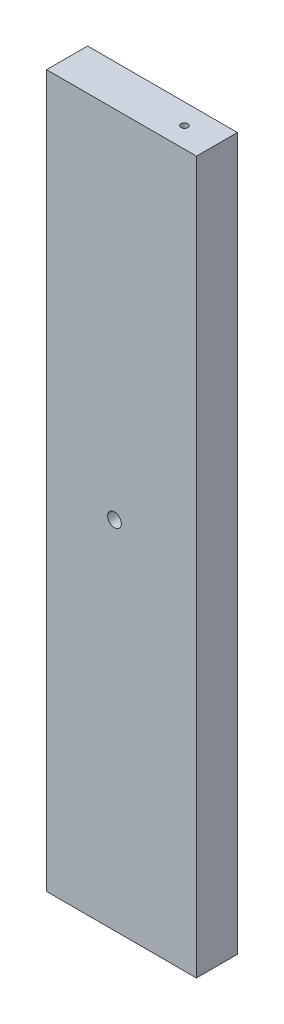
ISO-10303-21;
HEADER;
FILE_DESCRIPTION(('STEP AP214'),'2;1');
FILE_NAME('part.step','',(''),(''),'','','');
FILE_SCHEMA(('AUTOMOTIVE_DESIGN { 1 0 10303 214 1 1 1 1 }'));
ENDSEC;
DATA;
#1=APPLICATION_CONTEXT('core data for automotive mechanical design processes');
#2=APPLICATION_PROTOCOL_DEFINITION('international standard','automotive_design',2000,#1);
#3=PRODUCT_CONTEXT('',#1,'mechanical');
#4=PRODUCT('Part','Part','',(#3));
#5=PRODUCT_RELATED_PRODUCT_CATEGORY('part','',(#4));
#6=PRODUCT_DEFINITION_FORMATION('','',#4);
#7=PRODUCT_DEFINITION_CONTEXT('part definition',#1,'design');
#8=PRODUCT_DEFINITION('design','',#6,#7);
#9=PRODUCT_DEFINITION_SHAPE('','',#8);
#10=(LENGTH_UNIT() NAMED_UNIT(*) SI_UNIT(.MILLI.,.METRE.));
#11=(NAMED_UNIT(*) PLANE_ANGLE_UNIT() SI_UNIT($,.RADIAN.));
#12=(NAMED_UNIT(*) SI_UNIT($,.STERADIAN.) SOLID_ANGLE_UNIT());
#13=UNCERTAINTY_MEASURE_WITH_UNIT(LENGTH_MEASURE(1.E-05),#10,'distance_accuracy_value','');
#14=(GEOMETRIC_REPRESENTATION_CONTEXT(3) GLOBAL_UNCERTAINTY_ASSIGNED_CONTEXT((#13)) GLOBAL_UNIT_ASSIGNED_CONTEXT((#10,
#11,#12)) REPRESENTATION_CONTEXT('',''));
#15=CARTESIAN_POINT('',(0.,0.,0.));
#16=DIRECTION('',(0.,0.,1.));
#17=DIRECTION('',(1.,0.,0.));
#18=AXIS2_PLACEMENT_3D('',#15,#16,#17);
#19=CARTESIAN_POINT('',(209.352967180645,93.4499999969934,19.05));
#20=DIRECTION('',(1.,0.,0.));
#21=DIRECTION('',(0.,1.,0.));
#22=AXIS2_PLACEMENT_3D('',#19,#20,#21);
#23=PLANE('',#22);
#24=DIRECTION('',(0.,-1.,0.));
#25=VECTOR('',#24,1.);
#26=CARTESIAN_POINT('',(209.352967180645,93.4499999969934,0.));
#27=LINE('',#26,#25);
#28=CARTESIAN_POINT('',(209.352967180645,93.4499999969934,0.));
#29=VERTEX_POINT('',#28);
#30=CARTESIAN_POINT('',(209.352967180645,-237.499999991006,0.));
#31=VERTEX_POINT('',#30);
#32=EDGE_CURVE('E103',#29,#31,#27,.T.);
#33=ORIENTED_EDGE('',*,*,#32,.T.);
#34=DIRECTION('',(0.,0.,-1.));
#35=VECTOR('',#34,1.);
#36=CARTESIAN_POINT('',(209.352967180645,-237.499999991006,19.05));
#37=LINE('',#36,#35);
#38=CARTESIAN_POINT('',(209.352967180645,-237.499999991006,19.05));
#39=VERTEX_POINT('',#38);
#40=EDGE_CURVE('E11',#39,#31,#37,.T.);
#41=ORIENTED_EDGE('',*,*,#40,.F.);
#42=DIRECTION('',(0.,-1.,0.));
#43=VECTOR('',#42,1.);
#44=CARTESIAN_POINT('',(209.352967180645,93.4499999969934,19.05));
#45=LINE('',#44,#43);
#46=CARTESIAN_POINT('',(209.352967180645,93.4499999969934,19.05));
#47=VERTEX_POINT('',#46);
#48=EDGE_CURVE('E104',#47,#39,#45,.T.);
#49=ORIENTED_EDGE('',*,*,#48,.F.);
#50=DIRECTION('',(0.,0.,-1.));
#51=VECTOR('',#50,1.);
#52=CARTESIAN_POINT('',(209.352967180645,93.4499999969934,19.05));
#53=LINE('',#52,#51);
#54=EDGE_CURVE('E110',#47,#29,#53,.T.);
#55=ORIENTED_EDGE('',*,*,#54,.T.);
#56=EDGE_LOOP('',(#33,#41,#49,#55));
#57=FACE_BOUND('',#56,.T.);
#58=ADVANCED_FACE('F33',(#57),#23,.F.);
#59=CARTESIAN_POINT('',(209.352967180645,-237.499999991006,19.05));
#60=DIRECTION('',(0.,1.,0.));
#61=DIRECTION('',(0.,0.,1.));
#62=AXIS2_PLACEMENT_3D('',#59,#60,#61);
#63=PLANE('',#62);
#64=DIRECTION('',(1.,0.,0.));
#65=VECTOR('',#64,1.);
#66=CARTESIAN_POINT('',(209.352967180645,-237.499999991006,0.));
#67=LINE('',#66,#65);
#68=CARTESIAN_POINT('',(279.019945862424,-237.499999991006,0.));
#69=VERTEX_POINT('',#68);
#70=EDGE_CURVE('E113',#31,#69,#67,.T.);
#71=ORIENTED_EDGE('',*,*,#70,.T.);
#72=DIRECTION('',(0.,0.,-1.));
#73=VECTOR('',#72,1.);
#74=CARTESIAN_POINT('',(279.019945862424,-237.499999991006,19.05));
#75=LINE('',#74,#73);
#76=CARTESIAN_POINT('',(279.019945862424,-237.499999991006,19.05));
#77=VERTEX_POINT('',#76);
#78=EDGE_CURVE('E42',#77,#69,#75,.T.);
#79=ORIENTED_EDGE('',*,*,#78,.F.);
#80=DIRECTION('',(1.,0.,0.));
#81=VECTOR('',#80,1.);
#82=CARTESIAN_POINT('',(209.352967180645,-237.499999991006,19.05));
#83=LINE('',#82,#81);
#84=EDGE_CURVE('E81',#39,#77,#83,.T.);
#85=ORIENTED_EDGE('',*,*,#84,.F.);
#86=ORIENTED_EDGE('',*,*,#40,.T.);
#87=EDGE_LOOP('',(#71,#79,#85,#86));
#88=FACE_BOUND('',#87,.T.);
#89=ADVANCED_FACE('F139',(#88),#63,.F.);
#90=CARTESIAN_POINT('',(279.019945862424,93.4499999969934,19.05));
#91=DIRECTION('',(-1.,0.,0.));
#92=DIRECTION('',(0.,-1.,0.));
#93=AXIS2_PLACEMENT_3D('',#90,#91,#92);
#94=PLANE('',#93);
#95=DIRECTION('',(0.,1.,0.));
#96=VECTOR('',#95,1.);
#97=CARTESIAN_POINT('',(279.019945862424,93.4499999969934,0.));
#98=LINE('',#97,#96);
#99=CARTESIAN_POINT('',(279.019945862424,93.4499999969934,0.));
#100=VERTEX_POINT('',#99);
#101=EDGE_CURVE('E68',#69,#100,#98,.T.);
#102=ORIENTED_EDGE('',*,*,#101,.T.);
#103=DIRECTION('',(0.,0.,-1.));
#104=VECTOR('',#103,1.);
#105=CARTESIAN_POINT('',(279.019945862424,93.4499999969934,19.05));
#106=LINE('',#105,#104);
#107=CARTESIAN_POINT('',(279.019945862424,93.4499999969934,19.05));
#108=VERTEX_POINT('',#107);
#109=EDGE_CURVE('E118',#108,#100,#106,.T.);
#110=ORIENTED_EDGE('',*,*,#109,.F.);
#111=DIRECTION('',(0.,1.,0.));
#112=VECTOR('',#111,1.);
#113=CARTESIAN_POINT('',(279.019945862424,93.4499999969934,19.05));
#114=LINE('',#113,#112);
#115=EDGE_CURVE('E107',#77,#108,#114,.T.);
#116=ORIENTED_EDGE('',*,*,#115,.F.);
#117=ORIENTED_EDGE('',*,*,#78,.T.);
#118=EDGE_LOOP('',(#102,#110,#116,#117));
#119=FACE_BOUND('',#118,.T.);
#120=ADVANCED_FACE('F121',(#119),#94,.F.);
#121=CARTESIAN_POINT('',(209.352967180645,93.4499999969934,19.05));
#122=DIRECTION('',(0.,-1.,0.));
#123=DIRECTION('',(0.,0.,-1.));
#124=AXIS2_PLACEMENT_3D('',#121,#122,#123);
#125=PLANE('',#124);
#126=CARTESIAN_POINT('',(263.929639335459,93.4499999969934,9.52499999999611));
#127=DIRECTION('',(0.,-1.,0.));
#128=DIRECTION('',(0.,0.,-1.));
#129=AXIS2_PLACEMENT_3D('',#126,#127,#128);
#130=CIRCLE('',#129,1.58750000000002);
#131=CARTESIAN_POINT('',(263.929639335459,93.4499999969934,7.93749999999609));
#132=VERTEX_POINT('',#131);
#133=EDGE_CURVE('E36',#132,#132,#130,.T.);
#134=ORIENTED_EDGE('',*,*,#133,.T.);
#135=EDGE_LOOP('',(#134));
#136=FACE_BOUND('',#135,.T.);
#137=DIRECTION('',(-1.,0.,0.));
#138=VECTOR('',#137,1.);
#139=CARTESIAN_POINT('',(209.352967180645,93.4499999969934,0.));
#140=LINE('',#139,#138);
#141=EDGE_CURVE('E74',#100,#29,#140,.T.);
#142=ORIENTED_EDGE('',*,*,#141,.T.);
#143=ORIENTED_EDGE('',*,*,#54,.F.);
#144=DIRECTION('',(-1.,0.,0.));
#145=VECTOR('',#144,1.);
#146=CARTESIAN_POINT('',(209.352967180645,93.4499999969934,19.05));
#147=LINE('',#146,#145);
#148=EDGE_CURVE('E50',#108,#47,#147,.T.);
#149=ORIENTED_EDGE('',*,*,#148,.F.);
#150=ORIENTED_EDGE('',*,*,#109,.T.);
#151=EDGE_LOOP('',(#142,#143,#149,#150));
#152=FACE_BOUND('',#151,.T.);
#153=ADVANCED_FACE('F128',(#136,#152),#125,.F.);
#154=CARTESIAN_POINT('',(0.,0.,19.05));
#155=DIRECTION('',(0.,0.,1.));
#156=DIRECTION('',(1.,0.,0.));
#157=AXIS2_PLACEMENT_3D('',#154,#155,#156);
#158=PLANE('',#157);
#159=CARTESIAN_POINT('',(240.91994586243,-72.0249999971041,19.05));
#160=DIRECTION('',(0.,0.,-1.));
#161=DIRECTION('',(-1.,0.,0.));
#162=AXIS2_PLACEMENT_3D('',#159,#160,#161);
#163=CIRCLE('',#162,3.17499999999993);
#164=CARTESIAN_POINT('',(237.744945862431,-72.0249999971041,19.05));
#165=VERTEX_POINT('',#164);
#166=EDGE_CURVE('E100',#165,#165,#163,.T.);
#167=ORIENTED_EDGE('',*,*,#166,.T.);
#168=EDGE_LOOP('',(#167));
#169=FACE_BOUND('',#168,.T.);
#170=ORIENTED_EDGE('',*,*,#48,.T.);
#171=ORIENTED_EDGE('',*,*,#84,.T.);
#172=ORIENTED_EDGE('',*,*,#115,.T.);
#173=ORIENTED_EDGE('',*,*,#148,.T.);
#174=EDGE_LOOP('',(#170,#171,#172,#173));
#175=FACE_BOUND('',#174,.T.);
#176=ADVANCED_FACE('F130',(#169,#175),#158,.T.);
#177=CARTESIAN_POINT('',(0.,0.,0.));
#178=DIRECTION('',(0.,0.,1.));
#179=DIRECTION('',(1.,0.,0.));
#180=AXIS2_PLACEMENT_3D('',#177,#178,#179);
#181=PLANE('',#180);
#182=CARTESIAN_POINT('',(240.91994586243,-72.0249999971041,0.));
#183=DIRECTION('',(0.,0.,-1.));
#184=DIRECTION('',(-1.,0.,0.));
#185=AXIS2_PLACEMENT_3D('',#182,#183,#184);
#186=CIRCLE('',#185,3.17499999999993);
#187=CARTESIAN_POINT('',(237.744945862431,-72.0249999971041,0.));
#188=VERTEX_POINT('',#187);
#189=EDGE_CURVE('E96',#188,#188,#186,.T.);
#190=ORIENTED_EDGE('',*,*,#189,.F.);
#191=EDGE_LOOP('',(#190));
#192=FACE_BOUND('',#191,.T.);
#193=ORIENTED_EDGE('',*,*,#32,.F.);
#194=ORIENTED_EDGE('',*,*,#141,.F.);
#195=ORIENTED_EDGE('',*,*,#101,.F.);
#196=ORIENTED_EDGE('',*,*,#70,.F.);
#197=EDGE_LOOP('',(#193,#194,#195,#196));
#198=FACE_BOUND('',#197,.T.);
#199=ADVANCED_FACE('F124',(#192,#198),#181,.F.);
#200=CARTESIAN_POINT('',(240.91994586243,-72.0249999971041,0.));
#201=DIRECTION('',(0.,0.,-1.));
#202=DIRECTION('',(-1.,0.,0.));
#203=AXIS2_PLACEMENT_3D('',#200,#201,#202);
#204=CYLINDRICAL_SURFACE('',#203,3.17499999999993);
#205=ORIENTED_EDGE('',*,*,#166,.F.);
#206=EDGE_LOOP('',(#205));
#207=FACE_BOUND('',#206,.T.);
#208=ORIENTED_EDGE('',*,*,#189,.T.);
#209=EDGE_LOOP('',(#208));
#210=FACE_BOUND('',#209,.T.);
#211=ADVANCED_FACE('F168',(#207,#210),#204,.F.);
#212=CARTESIAN_POINT('',(263.929639335459,112.499999997011,9.52499999999612));
#213=DIRECTION('',(0.,1.,0.));
#214=DIRECTION('',(0.,0.,1.));
#215=AXIS2_PLACEMENT_3D('',#212,#213,#214);
#216=CYLINDRICAL_SURFACE('',#215,1.58750000000002);
#217=CARTESIAN_POINT('',(263.929639335459,74.3999999970112,9.52499999999609));
#218=DIRECTION('',(0.,1.,0.));
#219=DIRECTION('',(0.,0.,1.));
#220=AXIS2_PLACEMENT_3D('',#217,#218,#219);
#221=CIRCLE('',#220,1.58750000000002);
#222=CARTESIAN_POINT('',(263.929639335459,74.3999999970112,11.1124999999961));
#223=VERTEX_POINT('',#222);
#224=EDGE_CURVE('E92',#223,#223,#221,.T.);
#225=ORIENTED_EDGE('',*,*,#224,.F.);
#226=EDGE_LOOP('',(#225));
#227=FACE_BOUND('',#226,.T.);
#228=ORIENTED_EDGE('',*,*,#133,.F.);
#229=EDGE_LOOP('',(#228));
#230=FACE_BOUND('',#229,.T.);
#231=ADVANCED_FACE('F88',(#227,#230),#216,.F.);
#232=CARTESIAN_POINT('',(263.929639335459,74.3999999970112,9.52499999999609));
#233=DIRECTION('',(0.,1.,0.));
#234=DIRECTION('',(0.,0.,1.));
#235=AXIS2_PLACEMENT_3D('',#232,#233,#234);
#236=CONICAL_SURFACE('',#235,1.58750000000002,1.02974425867666);
#237=CARTESIAN_POINT('',(263.929639335459,73.446133764305,9.52499999999609));
#238=VERTEX_POINT('',#237);
#239=VERTEX_LOOP('',#238);
#240=FACE_BOUND('',#239,.T.);
#241=ORIENTED_EDGE('',*,*,#224,.T.);
#242=EDGE_LOOP('',(#241));
#243=FACE_BOUND('',#242,.T.);
#244=ADVANCED_FACE('F85',(#240,#243),#236,.F.);
#245=CLOSED_SHELL('',(#58,#89,#120,#153,#176,#199,#211,#231,#244));
#246=MANIFOLD_SOLID_BREP('B2',#245);
#247=ADVANCED_BREP_SHAPE_REPRESENTATION('',(#18,#246),#14);
#248=SHAPE_DEFINITION_REPRESENTATION(#9,#247);
ENDSEC;
END-ISO-10303-21;
